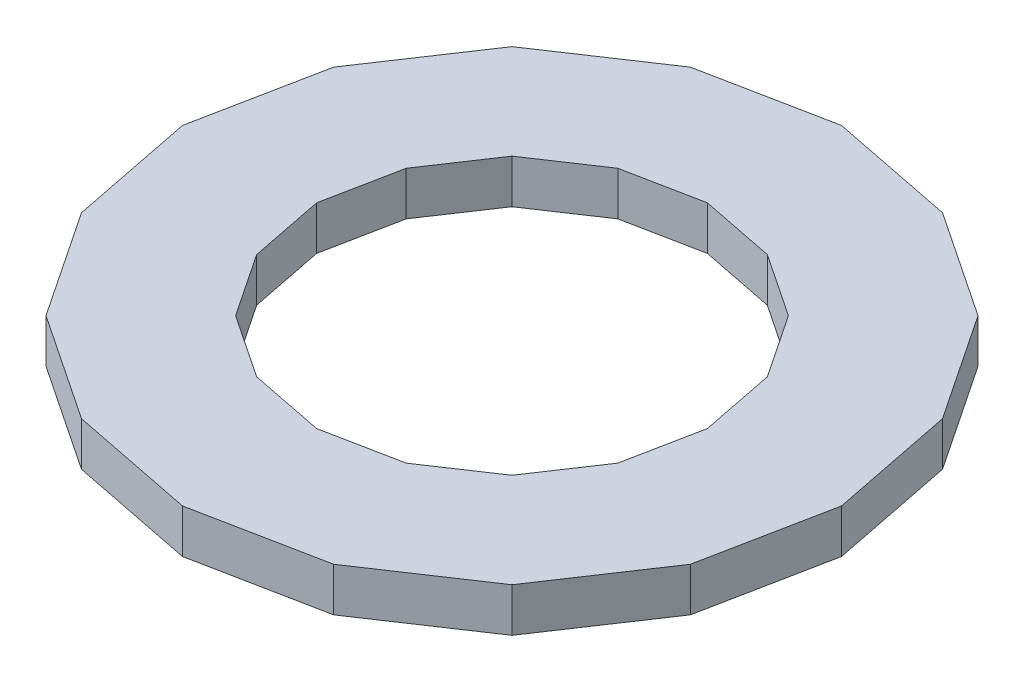
ISO-10303-21;
HEADER;
FILE_DESCRIPTION(('STEP AP214'),'2;1');
FILE_NAME('part.step','',(''),(''),'','','');
FILE_SCHEMA(('AUTOMOTIVE_DESIGN { 1 0 10303 214 1 1 1 1 }'));
ENDSEC;
DATA;
#1=APPLICATION_CONTEXT('core data for automotive mechanical design processes');
#2=APPLICATION_PROTOCOL_DEFINITION('international standard','automotive_design',2000,#1);
#3=PRODUCT_CONTEXT('',#1,'mechanical');
#4=PRODUCT('Part','Part','',(#3));
#5=PRODUCT_RELATED_PRODUCT_CATEGORY('part','',(#4));
#6=PRODUCT_DEFINITION_FORMATION('','',#4);
#7=PRODUCT_DEFINITION_CONTEXT('part definition',#1,'design');
#8=PRODUCT_DEFINITION('design','',#6,#7);
#9=PRODUCT_DEFINITION_SHAPE('','',#8);
#10=(LENGTH_UNIT() NAMED_UNIT(*) SI_UNIT(.MILLI.,.METRE.));
#11=(NAMED_UNIT(*) PLANE_ANGLE_UNIT() SI_UNIT($,.RADIAN.));
#12=(NAMED_UNIT(*) SI_UNIT($,.STERADIAN.) SOLID_ANGLE_UNIT());
#13=UNCERTAINTY_MEASURE_WITH_UNIT(LENGTH_MEASURE(1.E-05),#10,'distance_accuracy_value','');
#14=(GEOMETRIC_REPRESENTATION_CONTEXT(3) GLOBAL_UNCERTAINTY_ASSIGNED_CONTEXT((#13)) GLOBAL_UNIT_ASSIGNED_CONTEXT((#10,
#11,#12)) REPRESENTATION_CONTEXT('',''));
#15=CARTESIAN_POINT('',(0.,0.,0.));
#16=DIRECTION('',(0.,0.,1.));
#17=DIRECTION('',(1.,0.,0.));
#18=AXIS2_PLACEMENT_3D('',#15,#16,#17);
#19=CARTESIAN_POINT('',(0.,19.05,0.));
#20=DIRECTION('',(0.,1.,0.));
#21=DIRECTION('',(0.,0.,1.));
#22=AXIS2_PLACEMENT_3D('',#19,#20,#21);
#23=PLANE('',#22);
#24=DIRECTION('',(0.195090322016117,0.,-0.980785280403233));
#25=VECTOR('',#24,1.);
#26=CARTESIAN_POINT('',(132.314068025535,19.05,54.806281468931));
#27=LINE('',#26,#25);
#28=CARTESIAN_POINT('',(132.314068025535,19.05,54.806281468931));
#29=VERTEX_POINT('',#28);
#30=CARTESIAN_POINT('',(143.215715219795,19.05,-1.59247133447802E-12));
#31=VERTEX_POINT('',#30);
#32=EDGE_CURVE('E372',#29,#31,#27,.T.);
#33=ORIENTED_EDGE('',*,*,#32,.T.);
#34=DIRECTION('',(-0.195090322016139,0.,-0.980785280403228));
#35=VECTOR('',#34,1.);
#36=CARTESIAN_POINT('',(143.215715219795,19.05,-1.59247133447802E-12));
#37=LINE('',#36,#35);
#38=CARTESIAN_POINT('',(132.314068025533,19.05,-54.806281468934));
#39=VERTEX_POINT('',#38);
#40=EDGE_CURVE('E375',#31,#39,#37,.T.);
#41=ORIENTED_EDGE('',*,*,#40,.T.);
#42=DIRECTION('',(-0.555570233019612,0.,-0.831469612302539));
#43=VECTOR('',#42,1.);
#44=CARTESIAN_POINT('',(132.314068025533,19.05,-54.806281468934));
#45=LINE('',#44,#43);
#46=CARTESIAN_POINT('',(101.268803404398,19.05,-101.2688034044));
#47=VERTEX_POINT('',#46);
#48=EDGE_CURVE('E379',#39,#47,#45,.T.);
#49=ORIENTED_EDGE('',*,*,#48,.T.);
#50=DIRECTION('',(-0.831469612302551,0.,-0.555570233019593));
#51=VECTOR('',#50,1.);
#52=CARTESIAN_POINT('',(101.268803404398,19.05,-101.2688034044));
#53=LINE('',#52,#51);
#54=CARTESIAN_POINT('',(54.8062814689311,19.05,-132.314068025535));
#55=VERTEX_POINT('',#54);
#56=EDGE_CURVE('E382',#47,#55,#53,.T.);
#57=ORIENTED_EDGE('',*,*,#56,.T.);
#58=DIRECTION('',(-0.980785280403233,0.,-0.195090322016117));
#59=VECTOR('',#58,1.);
#60=CARTESIAN_POINT('',(54.8062814689311,19.05,-132.314068025535));
#61=LINE('',#60,#59);
#62=CARTESIAN_POINT('',(-1.68610724699765E-12,19.05,-143.215715219795));
#63=VERTEX_POINT('',#62);
#64=EDGE_CURVE('E384',#55,#63,#61,.T.);
#65=ORIENTED_EDGE('',*,*,#64,.T.);
#66=DIRECTION('',(-0.980785280403228,0.,0.195090322016139));
#67=VECTOR('',#66,1.);
#68=CARTESIAN_POINT('',(-1.68610724699765E-12,19.05,-143.215715219795));
#69=LINE('',#68,#67);
#70=CARTESIAN_POINT('',(-54.806281468934,19.05,-132.314068025533));
#71=VERTEX_POINT('',#70);
#72=EDGE_CURVE('E386',#63,#71,#69,.T.);
#73=ORIENTED_EDGE('',*,*,#72,.T.);
#74=DIRECTION('',(-0.831469612302539,0.,0.555570233019611));
#75=VECTOR('',#74,1.);
#76=CARTESIAN_POINT('',(-54.806281468934,19.05,-132.314068025533));
#77=LINE('',#76,#75);
#78=CARTESIAN_POINT('',(-101.2688034044,19.05,-101.268803404398));
#79=VERTEX_POINT('',#78);
#80=EDGE_CURVE('E388',#71,#79,#77,.T.);
#81=ORIENTED_EDGE('',*,*,#80,.T.);
#82=DIRECTION('',(-0.555570233019593,0.,0.831469612302551));
#83=VECTOR('',#82,1.);
#84=CARTESIAN_POINT('',(-101.2688034044,19.05,-101.268803404398));
#85=LINE('',#84,#83);
#86=CARTESIAN_POINT('',(-132.314068025535,19.05,-54.806281468931));
#87=VERTEX_POINT('',#86);
#88=EDGE_CURVE('E390',#79,#87,#85,.T.);
#89=ORIENTED_EDGE('',*,*,#88,.T.);
#90=DIRECTION('',(-0.195090322016117,0.,0.980785280403233));
#91=VECTOR('',#90,1.);
#92=CARTESIAN_POINT('',(-132.314068025535,19.05,-54.806281468931));
#93=LINE('',#92,#91);
#94=CARTESIAN_POINT('',(-143.215715219795,19.05,1.53307639008423E-12));
#95=VERTEX_POINT('',#94);
#96=EDGE_CURVE('E392',#87,#95,#93,.T.);
#97=ORIENTED_EDGE('',*,*,#96,.T.);
#98=DIRECTION('',(0.195090322016139,0.,0.980785280403228));
#99=VECTOR('',#98,1.);
#100=CARTESIAN_POINT('',(-143.215715219795,19.05,1.53307639008423E-12));
#101=LINE('',#100,#99);
#102=CARTESIAN_POINT('',(-132.314068025533,19.05,54.806281468934));
#103=VERTEX_POINT('',#102);
#104=EDGE_CURVE('E394',#95,#103,#101,.T.);
#105=ORIENTED_EDGE('',*,*,#104,.T.);
#106=DIRECTION('',(0.555570233019611,0.,0.831469612302539));
#107=VECTOR('',#106,1.);
#108=CARTESIAN_POINT('',(-132.314068025533,19.05,54.806281468934));
#109=LINE('',#108,#107);
#110=CARTESIAN_POINT('',(-101.268803404398,19.05,101.2688034044));
#111=VERTEX_POINT('',#110);
#112=EDGE_CURVE('E396',#103,#111,#109,.T.);
#113=ORIENTED_EDGE('',*,*,#112,.T.);
#114=DIRECTION('',(0.831469612302551,0.,0.555570233019593));
#115=VECTOR('',#114,1.);
#116=CARTESIAN_POINT('',(-101.268803404398,19.05,101.2688034044));
#117=LINE('',#116,#115);
#118=CARTESIAN_POINT('',(-54.8062814689311,19.05,132.314068025535));
#119=VERTEX_POINT('',#118);
#120=EDGE_CURVE('E398',#111,#119,#117,.T.);
#121=ORIENTED_EDGE('',*,*,#120,.T.);
#122=DIRECTION('',(0.980785280403233,0.,0.195090322016118));
#123=VECTOR('',#122,1.);
#124=CARTESIAN_POINT('',(-54.8062814689311,19.05,132.314068025535));
#125=LINE('',#124,#123);
#126=CARTESIAN_POINT('',(1.55718594322189E-12,19.05,143.215715219795));
#127=VERTEX_POINT('',#126);
#128=EDGE_CURVE('E400',#119,#127,#125,.T.);
#129=ORIENTED_EDGE('',*,*,#128,.T.);
#130=DIRECTION('',(0.980785280403228,0.,-0.195090322016139));
#131=VECTOR('',#130,1.);
#132=CARTESIAN_POINT('',(1.55718594322189E-12,19.05,143.215715219795));
#133=LINE('',#132,#131);
#134=CARTESIAN_POINT('',(54.8062814689339,19.05,132.314068025534));
#135=VERTEX_POINT('',#134);
#136=EDGE_CURVE('E402',#127,#135,#133,.T.);
#137=ORIENTED_EDGE('',*,*,#136,.T.);
#138=DIRECTION('',(0.831469612302539,0.,-0.555570233019612));
#139=VECTOR('',#138,1.);
#140=CARTESIAN_POINT('',(54.8062814689339,19.05,132.314068025534));
#141=LINE('',#140,#139);
#142=CARTESIAN_POINT('',(101.2688034044,19.05,101.268803404398));
#143=VERTEX_POINT('',#142);
#144=EDGE_CURVE('E404',#135,#143,#141,.T.);
#145=ORIENTED_EDGE('',*,*,#144,.T.);
#146=DIRECTION('',(0.555570233019593,0.,-0.831469612302551));
#147=VECTOR('',#146,1.);
#148=CARTESIAN_POINT('',(101.2688034044,19.05,101.268803404398));
#149=LINE('',#148,#147);
#150=EDGE_CURVE('E407',#143,#29,#149,.T.);
#151=ORIENTED_EDGE('',*,*,#150,.T.);
#152=EDGE_LOOP('',(#33,#41,#49,#57,#65,#73,#81,#89,#97,#105,#113,#121,#129,#137,#145,#151));
#153=FACE_BOUND('',#152,.T.);
#154=DIRECTION('',(-0.195090322016139,0.,-0.980785280403228));
#155=VECTOR('',#154,1.);
#156=CARTESIAN_POINT('',(84.9460805281899,19.05,-9.53928678404052E-13));
#157=LINE('',#156,#155);
#158=CARTESIAN_POINT('',(84.9460805281899,19.05,-9.53928678404052E-13));
#159=VERTEX_POINT('',#158);
#160=CARTESIAN_POINT('',(78.4799451670499,19.05,-32.5074576624899));
#161=VERTEX_POINT('',#160);
#162=EDGE_CURVE('E251',#159,#161,#157,.T.);
#163=ORIENTED_EDGE('',*,*,#162,.F.);
#164=DIRECTION('',(0.195090322016117,0.,-0.980785280403233));
#165=VECTOR('',#164,1.);
#166=CARTESIAN_POINT('',(78.4799451670506,19.05,32.5074576624882));
#167=LINE('',#166,#165);
#168=CARTESIAN_POINT('',(78.4799451670506,19.05,32.5074576624882));
#169=VERTEX_POINT('',#168);
#170=EDGE_CURVE('E243',#169,#159,#167,.T.);
#171=ORIENTED_EDGE('',*,*,#170,.F.);
#172=DIRECTION('',(0.555570233019593,0.,-0.831469612302552));
#173=VECTOR('',#172,1.);
#174=CARTESIAN_POINT('',(60.0659495767023,19.05,60.065949576701));
#175=LINE('',#174,#173);
#176=CARTESIAN_POINT('',(60.0659495767023,19.05,60.065949576701));
#177=VERTEX_POINT('',#176);
#178=EDGE_CURVE('E297',#177,#169,#175,.T.);
#179=ORIENTED_EDGE('',*,*,#178,.F.);
#180=DIRECTION('',(0.831469612302539,0.,-0.555570233019611));
#181=VECTOR('',#180,1.);
#182=CARTESIAN_POINT('',(32.50745766249,19.05,78.4799451670499));
#183=LINE('',#182,#181);
#184=CARTESIAN_POINT('',(32.50745766249,19.05,78.4799451670499));
#185=VERTEX_POINT('',#184);
#186=EDGE_CURVE('E294',#185,#177,#183,.T.);
#187=ORIENTED_EDGE('',*,*,#186,.F.);
#188=DIRECTION('',(0.980785280403228,0.,-0.19509032201614));
#189=VECTOR('',#188,1.);
#190=CARTESIAN_POINT('',(9.82701200833361E-13,19.05,84.94608052819));
#191=LINE('',#190,#189);
#192=CARTESIAN_POINT('',(9.82701200833361E-13,19.05,84.94608052819));
#193=VERTEX_POINT('',#192);
#194=EDGE_CURVE('E292',#193,#185,#191,.T.);
#195=ORIENTED_EDGE('',*,*,#194,.F.);
#196=DIRECTION('',(0.980785280403233,0.,0.195090322016117));
#197=VECTOR('',#196,1.);
#198=CARTESIAN_POINT('',(-32.5074576624881,19.05,78.4799451670506));
#199=LINE('',#198,#197);
#200=CARTESIAN_POINT('',(-32.5074576624881,19.05,78.4799451670506));
#201=VERTEX_POINT('',#200);
#202=EDGE_CURVE('E290',#201,#193,#199,.T.);
#203=ORIENTED_EDGE('',*,*,#202,.F.);
#204=DIRECTION('',(0.831469612302551,0.,0.555570233019593));
#205=VECTOR('',#204,1.);
#206=CARTESIAN_POINT('',(-60.0659495767009,19.05,60.0659495767023));
#207=LINE('',#206,#205);
#208=CARTESIAN_POINT('',(-60.0659495767009,19.05,60.0659495767023));
#209=VERTEX_POINT('',#208);
#210=EDGE_CURVE('E288',#209,#201,#207,.T.);
#211=ORIENTED_EDGE('',*,*,#210,.F.);
#212=DIRECTION('',(0.555570233019612,0.,0.831469612302539));
#213=VECTOR('',#212,1.);
#214=CARTESIAN_POINT('',(-78.4799451670498,19.05,32.5074576624899));
#215=LINE('',#214,#213);
#216=CARTESIAN_POINT('',(-78.4799451670498,19.05,32.5074576624899));
#217=VERTEX_POINT('',#216);
#218=EDGE_CURVE('E286',#217,#209,#215,.T.);
#219=ORIENTED_EDGE('',*,*,#218,.F.);
#220=DIRECTION('',(0.195090322016139,0.,0.980785280403228));
#221=VECTOR('',#220,1.);
#222=CARTESIAN_POINT('',(-84.9460805281899,19.05,9.51419658589963E-13));
#223=LINE('',#222,#221);
#224=CARTESIAN_POINT('',(-84.9460805281899,19.05,9.51419658589963E-13));
#225=VERTEX_POINT('',#224);
#226=EDGE_CURVE('E284',#225,#217,#223,.T.);
#227=ORIENTED_EDGE('',*,*,#226,.F.);
#228=DIRECTION('',(-0.195090322016117,0.,0.980785280403233));
#229=VECTOR('',#228,1.);
#230=CARTESIAN_POINT('',(-78.4799451670506,19.05,-32.5074576624881));
#231=LINE('',#230,#229);
#232=CARTESIAN_POINT('',(-78.4799451670506,19.05,-32.5074576624881));
#233=VERTEX_POINT('',#232);
#234=EDGE_CURVE('E282',#233,#225,#231,.T.);
#235=ORIENTED_EDGE('',*,*,#234,.F.);
#236=DIRECTION('',(-0.555570233019593,0.,0.831469612302551));
#237=VECTOR('',#236,1.);
#238=CARTESIAN_POINT('',(-60.0659495767023,19.05,-60.0659495767009));
#239=LINE('',#238,#237);
#240=CARTESIAN_POINT('',(-60.0659495767023,19.05,-60.0659495767009));
#241=VERTEX_POINT('',#240);
#242=EDGE_CURVE('E280',#241,#233,#239,.T.);
#243=ORIENTED_EDGE('',*,*,#242,.F.);
#244=DIRECTION('',(-0.831469612302539,0.,0.555570233019612));
#245=VECTOR('',#244,1.);
#246=CARTESIAN_POINT('',(-32.5074576624899,19.05,-78.4799451670499));
#247=LINE('',#246,#245);
#248=CARTESIAN_POINT('',(-32.5074576624899,19.05,-78.4799451670499));
#249=VERTEX_POINT('',#248);
#250=EDGE_CURVE('E278',#249,#241,#247,.T.);
#251=ORIENTED_EDGE('',*,*,#250,.F.);
#252=DIRECTION('',(-0.980785280403228,0.,0.195090322016139));
#253=VECTOR('',#252,1.);
#254=CARTESIAN_POINT('',(-9.74271516221104E-13,19.05,-84.9460805281899));
#255=LINE('',#254,#253);
#256=CARTESIAN_POINT('',(-9.74271516221104E-13,19.05,-84.9460805281899));
#257=VERTEX_POINT('',#256);
#258=EDGE_CURVE('E276',#257,#249,#255,.T.);
#259=ORIENTED_EDGE('',*,*,#258,.F.);
#260=DIRECTION('',(-0.980785280403233,0.,-0.195090322016117));
#261=VECTOR('',#260,1.);
#262=CARTESIAN_POINT('',(32.5074576624882,19.05,-78.4799451670506));
#263=LINE('',#262,#261);
#264=CARTESIAN_POINT('',(32.5074576624882,19.05,-78.4799451670506));
#265=VERTEX_POINT('',#264);
#266=EDGE_CURVE('E274',#265,#257,#263,.T.);
#267=ORIENTED_EDGE('',*,*,#266,.F.);
#268=DIRECTION('',(-0.831469612302552,0.,-0.555570233019593));
#269=VECTOR('',#268,1.);
#270=CARTESIAN_POINT('',(60.065949576701,19.05,-60.0659495767023));
#271=LINE('',#270,#269);
#272=CARTESIAN_POINT('',(60.065949576701,19.05,-60.0659495767023));
#273=VERTEX_POINT('',#272);
#274=EDGE_CURVE('E270',#273,#265,#271,.T.);
#275=ORIENTED_EDGE('',*,*,#274,.F.);
#276=DIRECTION('',(-0.555570233019612,0.,-0.831469612302539));
#277=VECTOR('',#276,1.);
#278=CARTESIAN_POINT('',(78.4799451670499,19.05,-32.5074576624899));
#279=LINE('',#278,#277);
#280=EDGE_CURVE('E264',#161,#273,#279,.T.);
#281=ORIENTED_EDGE('',*,*,#280,.F.);
#282=EDGE_LOOP('',(#163,#171,#179,#187,#195,#203,#211,#219,#227,#235,#243,#251,#259,#267,#275,#281));
#283=FACE_BOUND('',#282,.T.);
#284=ADVANCED_FACE('F34',(#153,#283),#23,.T.);
#285=CARTESIAN_POINT('',(0.,0.,0.));
#286=DIRECTION('',(0.,1.,0.));
#287=DIRECTION('',(0.,0.,1.));
#288=AXIS2_PLACEMENT_3D('',#285,#286,#287);
#289=PLANE('',#288);
#290=DIRECTION('',(0.195090322016117,0.,-0.980785280403233));
#291=VECTOR('',#290,1.);
#292=CARTESIAN_POINT('',(132.314068025535,0.,54.806281468931));
#293=LINE('',#292,#291);
#294=CARTESIAN_POINT('',(132.314068025535,0.,54.806281468931));
#295=VERTEX_POINT('',#294);
#296=CARTESIAN_POINT('',(143.215715219795,0.,-1.59247133447802E-12));
#297=VERTEX_POINT('',#296);
#298=EDGE_CURVE('E259',#295,#297,#293,.T.);
#299=ORIENTED_EDGE('',*,*,#298,.F.);
#300=DIRECTION('',(0.555570233019593,0.,-0.831469612302551));
#301=VECTOR('',#300,1.);
#302=CARTESIAN_POINT('',(101.2688034044,0.,101.268803404398));
#303=LINE('',#302,#301);
#304=CARTESIAN_POINT('',(101.2688034044,0.,101.268803404398));
#305=VERTEX_POINT('',#304);
#306=EDGE_CURVE('E376',#305,#295,#303,.T.);
#307=ORIENTED_EDGE('',*,*,#306,.F.);
#308=DIRECTION('',(0.831469612302539,0.,-0.555570233019612));
#309=VECTOR('',#308,1.);
#310=CARTESIAN_POINT('',(54.8062814689339,0.,132.314068025534));
#311=LINE('',#310,#309);
#312=CARTESIAN_POINT('',(54.8062814689339,0.,132.314068025534));
#313=VERTEX_POINT('',#312);
#314=EDGE_CURVE('E439',#313,#305,#311,.T.);
#315=ORIENTED_EDGE('',*,*,#314,.F.);
#316=DIRECTION('',(0.980785280403228,0.,-0.195090322016139));
#317=VECTOR('',#316,1.);
#318=CARTESIAN_POINT('',(1.55718594322189E-12,0.,143.215715219795));
#319=LINE('',#318,#317);
#320=CARTESIAN_POINT('',(1.55718594322189E-12,0.,143.215715219795));
#321=VERTEX_POINT('',#320);
#322=EDGE_CURVE('E437',#321,#313,#319,.T.);
#323=ORIENTED_EDGE('',*,*,#322,.F.);
#324=DIRECTION('',(0.980785280403233,0.,0.195090322016118));
#325=VECTOR('',#324,1.);
#326=CARTESIAN_POINT('',(-54.8062814689311,0.,132.314068025535));
#327=LINE('',#326,#325);
#328=CARTESIAN_POINT('',(-54.8062814689311,0.,132.314068025535));
#329=VERTEX_POINT('',#328);
#330=EDGE_CURVE('E435',#329,#321,#327,.T.);
#331=ORIENTED_EDGE('',*,*,#330,.F.);
#332=DIRECTION('',(0.831469612302551,0.,0.555570233019593));
#333=VECTOR('',#332,1.);
#334=CARTESIAN_POINT('',(-101.268803404398,0.,101.2688034044));
#335=LINE('',#334,#333);
#336=CARTESIAN_POINT('',(-101.268803404398,0.,101.2688034044));
#337=VERTEX_POINT('',#336);
#338=EDGE_CURVE('E433',#337,#329,#335,.T.);
#339=ORIENTED_EDGE('',*,*,#338,.F.);
#340=DIRECTION('',(0.555570233019611,0.,0.831469612302539));
#341=VECTOR('',#340,1.);
#342=CARTESIAN_POINT('',(-132.314068025533,0.,54.806281468934));
#343=LINE('',#342,#341);
#344=CARTESIAN_POINT('',(-132.314068025533,0.,54.806281468934));
#345=VERTEX_POINT('',#344);
#346=EDGE_CURVE('E431',#345,#337,#343,.T.);
#347=ORIENTED_EDGE('',*,*,#346,.F.);
#348=DIRECTION('',(0.195090322016139,0.,0.980785280403228));
#349=VECTOR('',#348,1.);
#350=CARTESIAN_POINT('',(-143.215715219795,0.,1.53307639008423E-12));
#351=LINE('',#350,#349);
#352=CARTESIAN_POINT('',(-143.215715219795,0.,1.53307639008423E-12));
#353=VERTEX_POINT('',#352);
#354=EDGE_CURVE('E429',#353,#345,#351,.T.);
#355=ORIENTED_EDGE('',*,*,#354,.F.);
#356=DIRECTION('',(-0.195090322016117,0.,0.980785280403233));
#357=VECTOR('',#356,1.);
#358=CARTESIAN_POINT('',(-132.314068025535,0.,-54.806281468931));
#359=LINE('',#358,#357);
#360=CARTESIAN_POINT('',(-132.314068025535,0.,-54.806281468931));
#361=VERTEX_POINT('',#360);
#362=EDGE_CURVE('E427',#361,#353,#359,.T.);
#363=ORIENTED_EDGE('',*,*,#362,.F.);
#364=DIRECTION('',(-0.555570233019593,0.,0.831469612302551));
#365=VECTOR('',#364,1.);
#366=CARTESIAN_POINT('',(-101.2688034044,0.,-101.268803404398));
#367=LINE('',#366,#365);
#368=CARTESIAN_POINT('',(-101.2688034044,0.,-101.268803404398));
#369=VERTEX_POINT('',#368);
#370=EDGE_CURVE('E425',#369,#361,#367,.T.);
#371=ORIENTED_EDGE('',*,*,#370,.F.);
#372=DIRECTION('',(-0.831469612302539,0.,0.555570233019611));
#373=VECTOR('',#372,1.);
#374=CARTESIAN_POINT('',(-54.806281468934,0.,-132.314068025533));
#375=LINE('',#374,#373);
#376=CARTESIAN_POINT('',(-54.806281468934,0.,-132.314068025533));
#377=VERTEX_POINT('',#376);
#378=EDGE_CURVE('E423',#377,#369,#375,.T.);
#379=ORIENTED_EDGE('',*,*,#378,.F.);
#380=DIRECTION('',(-0.980785280403228,0.,0.195090322016139));
#381=VECTOR('',#380,1.);
#382=CARTESIAN_POINT('',(-1.68610724699765E-12,0.,-143.215715219795));
#383=LINE('',#382,#381);
#384=CARTESIAN_POINT('',(-1.68610724699765E-12,0.,-143.215715219795));
#385=VERTEX_POINT('',#384);
#386=EDGE_CURVE('E421',#385,#377,#383,.T.);
#387=ORIENTED_EDGE('',*,*,#386,.F.);
#388=DIRECTION('',(-0.980785280403233,0.,-0.195090322016117));
#389=VECTOR('',#388,1.);
#390=CARTESIAN_POINT('',(54.8062814689311,0.,-132.314068025535));
#391=LINE('',#390,#389);
#392=CARTESIAN_POINT('',(54.8062814689311,0.,-132.314068025535));
#393=VERTEX_POINT('',#392);
#394=EDGE_CURVE('E419',#393,#385,#391,.T.);
#395=ORIENTED_EDGE('',*,*,#394,.F.);
#396=DIRECTION('',(-0.831469612302551,0.,-0.555570233019593));
#397=VECTOR('',#396,1.);
#398=CARTESIAN_POINT('',(101.268803404398,0.,-101.2688034044));
#399=LINE('',#398,#397);
#400=CARTESIAN_POINT('',(101.268803404398,0.,-101.2688034044));
#401=VERTEX_POINT('',#400);
#402=EDGE_CURVE('E417',#401,#393,#399,.T.);
#403=ORIENTED_EDGE('',*,*,#402,.F.);
#404=DIRECTION('',(-0.555570233019612,0.,-0.831469612302539));
#405=VECTOR('',#404,1.);
#406=CARTESIAN_POINT('',(132.314068025533,0.,-54.806281468934));
#407=LINE('',#406,#405);
#408=CARTESIAN_POINT('',(132.314068025533,0.,-54.806281468934));
#409=VERTEX_POINT('',#408);
#410=EDGE_CURVE('E414',#409,#401,#407,.T.);
#411=ORIENTED_EDGE('',*,*,#410,.F.);
#412=DIRECTION('',(-0.195090322016139,0.,-0.980785280403228));
#413=VECTOR('',#412,1.);
#414=CARTESIAN_POINT('',(143.215715219795,0.,-1.59247133447802E-12));
#415=LINE('',#414,#413);
#416=EDGE_CURVE('E412',#297,#409,#415,.T.);
#417=ORIENTED_EDGE('',*,*,#416,.F.);
#418=EDGE_LOOP('',(#299,#307,#315,#323,#331,#339,#347,#355,#363,#371,#379,#387,#395,#403,#411,#417));
#419=FACE_BOUND('',#418,.T.);
#420=DIRECTION('',(0.195090322016117,0.,-0.980785280403233));
#421=VECTOR('',#420,1.);
#422=CARTESIAN_POINT('',(78.4799451670506,0.,32.5074576624882));
#423=LINE('',#422,#421);
#424=CARTESIAN_POINT('',(78.4799451670506,0.,32.5074576624882));
#425=VERTEX_POINT('',#424);
#426=CARTESIAN_POINT('',(84.9460805281899,0.,-9.53928678404052E-13));
#427=VERTEX_POINT('',#426);
#428=EDGE_CURVE('E57',#425,#427,#423,.T.);
#429=ORIENTED_EDGE('',*,*,#428,.T.);
#430=DIRECTION('',(-0.195090322016139,0.,-0.980785280403228));
#431=VECTOR('',#430,1.);
#432=CARTESIAN_POINT('',(84.9460805281899,0.,-9.53928678404052E-13));
#433=LINE('',#432,#431);
#434=CARTESIAN_POINT('',(78.4799451670499,0.,-32.5074576624899));
#435=VERTEX_POINT('',#434);
#436=EDGE_CURVE('E258',#427,#435,#433,.T.);
#437=ORIENTED_EDGE('',*,*,#436,.T.);
#438=DIRECTION('',(-0.555570233019612,0.,-0.831469612302539));
#439=VECTOR('',#438,1.);
#440=CARTESIAN_POINT('',(78.4799451670499,0.,-32.5074576624899));
#441=LINE('',#440,#439);
#442=CARTESIAN_POINT('',(60.065949576701,0.,-60.0659495767023));
#443=VERTEX_POINT('',#442);
#444=EDGE_CURVE('E301',#435,#443,#441,.T.);
#445=ORIENTED_EDGE('',*,*,#444,.T.);
#446=DIRECTION('',(-0.831469612302552,0.,-0.555570233019593));
#447=VECTOR('',#446,1.);
#448=CARTESIAN_POINT('',(60.065949576701,0.,-60.0659495767023));
#449=LINE('',#448,#447);
#450=CARTESIAN_POINT('',(32.5074576624882,0.,-78.4799451670506));
#451=VERTEX_POINT('',#450);
#452=EDGE_CURVE('E304',#443,#451,#449,.T.);
#453=ORIENTED_EDGE('',*,*,#452,.T.);
#454=DIRECTION('',(-0.980785280403233,0.,-0.195090322016117));
#455=VECTOR('',#454,1.);
#456=CARTESIAN_POINT('',(32.5074576624882,0.,-78.4799451670506));
#457=LINE('',#456,#455);
#458=CARTESIAN_POINT('',(-9.74271516221104E-13,0.,-84.9460805281899));
#459=VERTEX_POINT('',#458);
#460=EDGE_CURVE('E307',#451,#459,#457,.T.);
#461=ORIENTED_EDGE('',*,*,#460,.T.);
#462=DIRECTION('',(-0.980785280403228,0.,0.195090322016139));
#463=VECTOR('',#462,1.);
#464=CARTESIAN_POINT('',(-9.74271516221104E-13,0.,-84.9460805281899));
#465=LINE('',#464,#463);
#466=CARTESIAN_POINT('',(-32.5074576624899,0.,-78.4799451670499));
#467=VERTEX_POINT('',#466);
#468=EDGE_CURVE('E310',#459,#467,#465,.T.);
#469=ORIENTED_EDGE('',*,*,#468,.T.);
#470=DIRECTION('',(-0.831469612302539,0.,0.555570233019612));
#471=VECTOR('',#470,1.);
#472=CARTESIAN_POINT('',(-32.5074576624899,0.,-78.4799451670499));
#473=LINE('',#472,#471);
#474=CARTESIAN_POINT('',(-60.0659495767023,0.,-60.0659495767009));
#475=VERTEX_POINT('',#474);
#476=EDGE_CURVE('E313',#467,#475,#473,.T.);
#477=ORIENTED_EDGE('',*,*,#476,.T.);
#478=DIRECTION('',(-0.555570233019593,0.,0.831469612302551));
#479=VECTOR('',#478,1.);
#480=CARTESIAN_POINT('',(-60.0659495767023,0.,-60.0659495767009));
#481=LINE('',#480,#479);
#482=CARTESIAN_POINT('',(-78.4799451670506,0.,-32.5074576624881));
#483=VERTEX_POINT('',#482);
#484=EDGE_CURVE('E316',#475,#483,#481,.T.);
#485=ORIENTED_EDGE('',*,*,#484,.T.);
#486=DIRECTION('',(-0.195090322016117,0.,0.980785280403233));
#487=VECTOR('',#486,1.);
#488=CARTESIAN_POINT('',(-78.4799451670506,0.,-32.5074576624881));
#489=LINE('',#488,#487);
#490=CARTESIAN_POINT('',(-84.9460805281899,0.,9.51419658589963E-13));
#491=VERTEX_POINT('',#490);
#492=EDGE_CURVE('E319',#483,#491,#489,.T.);
#493=ORIENTED_EDGE('',*,*,#492,.T.);
#494=DIRECTION('',(0.195090322016139,0.,0.980785280403228));
#495=VECTOR('',#494,1.);
#496=CARTESIAN_POINT('',(-84.9460805281899,0.,9.51419658589963E-13));
#497=LINE('',#496,#495);
#498=CARTESIAN_POINT('',(-78.4799451670498,0.,32.5074576624899));
#499=VERTEX_POINT('',#498);
#500=EDGE_CURVE('E322',#491,#499,#497,.T.);
#501=ORIENTED_EDGE('',*,*,#500,.T.);
#502=DIRECTION('',(0.555570233019612,0.,0.831469612302539));
#503=VECTOR('',#502,1.);
#504=CARTESIAN_POINT('',(-78.4799451670498,0.,32.5074576624899));
#505=LINE('',#504,#503);
#506=CARTESIAN_POINT('',(-60.0659495767009,0.,60.0659495767023));
#507=VERTEX_POINT('',#506);
#508=EDGE_CURVE('E325',#499,#507,#505,.T.);
#509=ORIENTED_EDGE('',*,*,#508,.T.);
#510=DIRECTION('',(0.831469612302551,0.,0.555570233019593));
#511=VECTOR('',#510,1.);
#512=CARTESIAN_POINT('',(-60.0659495767009,0.,60.0659495767023));
#513=LINE('',#512,#511);
#514=CARTESIAN_POINT('',(-32.5074576624881,0.,78.4799451670506));
#515=VERTEX_POINT('',#514);
#516=EDGE_CURVE('E329',#507,#515,#513,.T.);
#517=ORIENTED_EDGE('',*,*,#516,.T.);
#518=DIRECTION('',(0.980785280403233,0.,0.195090322016117));
#519=VECTOR('',#518,1.);
#520=CARTESIAN_POINT('',(-32.5074576624881,0.,78.4799451670506));
#521=LINE('',#520,#519);
#522=CARTESIAN_POINT('',(9.82701200833361E-13,0.,84.94608052819));
#523=VERTEX_POINT('',#522);
#524=EDGE_CURVE('E332',#515,#523,#521,.T.);
#525=ORIENTED_EDGE('',*,*,#524,.T.);
#526=DIRECTION('',(0.980785280403228,0.,-0.19509032201614));
#527=VECTOR('',#526,1.);
#528=CARTESIAN_POINT('',(9.82701200833361E-13,0.,84.94608052819));
#529=LINE('',#528,#527);
#530=CARTESIAN_POINT('',(32.50745766249,0.,78.4799451670499));
#531=VERTEX_POINT('',#530);
#532=EDGE_CURVE('E335',#523,#531,#529,.T.);
#533=ORIENTED_EDGE('',*,*,#532,.T.);
#534=DIRECTION('',(0.831469612302539,0.,-0.555570233019611));
#535=VECTOR('',#534,1.);
#536=CARTESIAN_POINT('',(32.50745766249,0.,78.4799451670499));
#537=LINE('',#536,#535);
#538=CARTESIAN_POINT('',(60.0659495767023,0.,60.065949576701));
#539=VERTEX_POINT('',#538);
#540=EDGE_CURVE('E338',#531,#539,#537,.T.);
#541=ORIENTED_EDGE('',*,*,#540,.T.);
#542=DIRECTION('',(0.555570233019593,0.,-0.831469612302552));
#543=VECTOR('',#542,1.);
#544=CARTESIAN_POINT('',(60.0659495767023,0.,60.065949576701));
#545=LINE('',#544,#543);
#546=EDGE_CURVE('E252',#539,#425,#545,.T.);
#547=ORIENTED_EDGE('',*,*,#546,.T.);
#548=EDGE_LOOP('',(#429,#437,#445,#453,#461,#469,#477,#485,#493,#501,#509,#517,#525,#533,#541,#547));
#549=FACE_BOUND('',#548,.T.);
#550=ADVANCED_FACE('F497',(#419,#549),#289,.F.);
#551=CARTESIAN_POINT('',(132.314068025535,19.05,54.806281468931));
#552=DIRECTION('',(-0.980785280403233,0.,-0.195090322016117));
#553=DIRECTION('',(-0.195090322016117,0.,0.980785280403233));
#554=AXIS2_PLACEMENT_3D('',#551,#552,#553);
#555=PLANE('',#554);
#556=ORIENTED_EDGE('',*,*,#298,.T.);
#557=DIRECTION('',(0.,-1.,0.));
#558=VECTOR('',#557,1.);
#559=CARTESIAN_POINT('',(143.215715219795,19.05,-1.59247133447802E-12));
#560=LINE('',#559,#558);
#561=EDGE_CURVE('E11',#31,#297,#560,.T.);
#562=ORIENTED_EDGE('',*,*,#561,.F.);
#563=ORIENTED_EDGE('',*,*,#32,.F.);
#564=DIRECTION('',(0.,-1.,0.));
#565=VECTOR('',#564,1.);
#566=CARTESIAN_POINT('',(132.314068025535,19.05,54.806281468931));
#567=LINE('',#566,#565);
#568=EDGE_CURVE('E409',#29,#295,#567,.T.);
#569=ORIENTED_EDGE('',*,*,#568,.T.);
#570=EDGE_LOOP('',(#556,#562,#563,#569));
#571=FACE_BOUND('',#570,.T.);
#572=ADVANCED_FACE('F36',(#571),#555,.F.);
#573=CARTESIAN_POINT('',(143.215715219795,19.05,-1.59247133447802E-12));
#574=DIRECTION('',(-0.980785280403228,0.,0.195090322016139));
#575=DIRECTION('',(0.195090322016139,0.,0.980785280403228));
#576=AXIS2_PLACEMENT_3D('',#573,#574,#575);
#577=PLANE('',#576);
#578=ORIENTED_EDGE('',*,*,#416,.T.);
#579=DIRECTION('',(0.,-1.,0.));
#580=VECTOR('',#579,1.);
#581=CARTESIAN_POINT('',(132.314068025533,19.05,-54.806281468934));
#582=LINE('',#581,#580);
#583=EDGE_CURVE('E42',#39,#409,#582,.T.);
#584=ORIENTED_EDGE('',*,*,#583,.F.);
#585=ORIENTED_EDGE('',*,*,#40,.F.);
#586=ORIENTED_EDGE('',*,*,#561,.T.);
#587=EDGE_LOOP('',(#578,#584,#585,#586));
#588=FACE_BOUND('',#587,.T.);
#589=ADVANCED_FACE('F514',(#588),#577,.F.);
#590=CARTESIAN_POINT('',(132.314068025533,19.05,-54.806281468934));
#591=DIRECTION('',(-0.831469612302539,0.,0.555570233019612));
#592=DIRECTION('',(0.555570233019612,0.,0.831469612302539));
#593=AXIS2_PLACEMENT_3D('',#590,#591,#592);
#594=PLANE('',#593);
#595=ORIENTED_EDGE('',*,*,#410,.T.);
#596=DIRECTION('',(0.,-1.,0.));
#597=VECTOR('',#596,1.);
#598=CARTESIAN_POINT('',(101.268803404398,19.05,-101.2688034044));
#599=LINE('',#598,#597);
#600=EDGE_CURVE('E482',#47,#401,#599,.T.);
#601=ORIENTED_EDGE('',*,*,#600,.F.);
#602=ORIENTED_EDGE('',*,*,#48,.F.);
#603=ORIENTED_EDGE('',*,*,#583,.T.);
#604=EDGE_LOOP('',(#595,#601,#602,#603));
#605=FACE_BOUND('',#604,.T.);
#606=ADVANCED_FACE('F491',(#605),#594,.F.);
#607=CARTESIAN_POINT('',(101.268803404398,19.05,-101.2688034044));
#608=DIRECTION('',(-0.555570233019593,0.,0.831469612302551));
#609=DIRECTION('',(0.831469612302551,0.,0.555570233019593));
#610=AXIS2_PLACEMENT_3D('',#607,#608,#609);
#611=PLANE('',#610);
#612=ORIENTED_EDGE('',*,*,#402,.T.);
#613=DIRECTION('',(0.,-1.,0.));
#614=VECTOR('',#613,1.);
#615=CARTESIAN_POINT('',(54.8062814689311,19.05,-132.314068025535));
#616=LINE('',#615,#614);
#617=EDGE_CURVE('E479',#55,#393,#616,.T.);
#618=ORIENTED_EDGE('',*,*,#617,.F.);
#619=ORIENTED_EDGE('',*,*,#56,.F.);
#620=ORIENTED_EDGE('',*,*,#600,.T.);
#621=EDGE_LOOP('',(#612,#618,#619,#620));
#622=FACE_BOUND('',#621,.T.);
#623=ADVANCED_FACE('F503',(#622),#611,.F.);
#624=CARTESIAN_POINT('',(54.8062814689311,19.05,-132.314068025535));
#625=DIRECTION('',(-0.195090322016117,0.,0.980785280403233));
#626=DIRECTION('',(0.980785280403233,0.,0.195090322016117));
#627=AXIS2_PLACEMENT_3D('',#624,#625,#626);
#628=PLANE('',#627);
#629=ORIENTED_EDGE('',*,*,#394,.T.);
#630=DIRECTION('',(0.,-1.,0.));
#631=VECTOR('',#630,1.);
#632=CARTESIAN_POINT('',(-1.68610724699765E-12,19.05,-143.215715219795));
#633=LINE('',#632,#631);
#634=EDGE_CURVE('E476',#63,#385,#633,.T.);
#635=ORIENTED_EDGE('',*,*,#634,.F.);
#636=ORIENTED_EDGE('',*,*,#64,.F.);
#637=ORIENTED_EDGE('',*,*,#617,.T.);
#638=EDGE_LOOP('',(#629,#635,#636,#637));
#639=FACE_BOUND('',#638,.T.);
#640=ADVANCED_FACE('F507',(#639),#628,.F.);
#641=CARTESIAN_POINT('',(-1.68610724699765E-12,19.05,-143.215715219795));
#642=DIRECTION('',(0.195090322016139,0.,0.980785280403228));
#643=DIRECTION('',(0.980785280403228,0.,-0.195090322016139));
#644=AXIS2_PLACEMENT_3D('',#641,#642,#643);
#645=PLANE('',#644);
#646=ORIENTED_EDGE('',*,*,#386,.T.);
#647=DIRECTION('',(0.,-1.,0.));
#648=VECTOR('',#647,1.);
#649=CARTESIAN_POINT('',(-54.806281468934,19.05,-132.314068025533));
#650=LINE('',#649,#648);
#651=EDGE_CURVE('E472',#71,#377,#650,.T.);
#652=ORIENTED_EDGE('',*,*,#651,.F.);
#653=ORIENTED_EDGE('',*,*,#72,.F.);
#654=ORIENTED_EDGE('',*,*,#634,.T.);
#655=EDGE_LOOP('',(#646,#652,#653,#654));
#656=FACE_BOUND('',#655,.T.);
#657=ADVANCED_FACE('F567',(#656),#645,.F.);
#658=CARTESIAN_POINT('',(-54.806281468934,19.05,-132.314068025533));
#659=DIRECTION('',(0.555570233019611,0.,0.831469612302539));
#660=DIRECTION('',(0.831469612302539,0.,-0.555570233019612));
#661=AXIS2_PLACEMENT_3D('',#658,#659,#660);
#662=PLANE('',#661);
#663=ORIENTED_EDGE('',*,*,#378,.T.);
#664=DIRECTION('',(0.,-1.,0.));
#665=VECTOR('',#664,1.);
#666=CARTESIAN_POINT('',(-101.2688034044,19.05,-101.268803404398));
#667=LINE('',#666,#665);
#668=EDGE_CURVE('E469',#79,#369,#667,.T.);
#669=ORIENTED_EDGE('',*,*,#668,.F.);
#670=ORIENTED_EDGE('',*,*,#80,.F.);
#671=ORIENTED_EDGE('',*,*,#651,.T.);
#672=EDGE_LOOP('',(#663,#669,#670,#671));
#673=FACE_BOUND('',#672,.T.);
#674=ADVANCED_FACE('F564',(#673),#662,.F.);
#675=CARTESIAN_POINT('',(-101.2688034044,19.05,-101.268803404398));
#676=DIRECTION('',(0.831469612302551,0.,0.555570233019593));
#677=DIRECTION('',(0.555570233019593,0.,-0.831469612302551));
#678=AXIS2_PLACEMENT_3D('',#675,#676,#677);
#679=PLANE('',#678);
#680=ORIENTED_EDGE('',*,*,#370,.T.);
#681=DIRECTION('',(0.,-1.,0.));
#682=VECTOR('',#681,1.);
#683=CARTESIAN_POINT('',(-132.314068025535,19.05,-54.806281468931));
#684=LINE('',#683,#682);
#685=EDGE_CURVE('E466',#87,#361,#684,.T.);
#686=ORIENTED_EDGE('',*,*,#685,.F.);
#687=ORIENTED_EDGE('',*,*,#88,.F.);
#688=ORIENTED_EDGE('',*,*,#668,.T.);
#689=EDGE_LOOP('',(#680,#686,#687,#688));
#690=FACE_BOUND('',#689,.T.);
#691=ADVANCED_FACE('F560',(#690),#679,.F.);
#692=CARTESIAN_POINT('',(-132.314068025535,19.05,-54.806281468931));
#693=DIRECTION('',(0.980785280403233,0.,0.195090322016117));
#694=DIRECTION('',(0.195090322016117,0.,-0.980785280403233));
#695=AXIS2_PLACEMENT_3D('',#692,#693,#694);
#696=PLANE('',#695);
#697=ORIENTED_EDGE('',*,*,#362,.T.);
#698=DIRECTION('',(0.,-1.,0.));
#699=VECTOR('',#698,1.);
#700=CARTESIAN_POINT('',(-143.215715219795,19.05,1.53307639008423E-12));
#701=LINE('',#700,#699);
#702=EDGE_CURVE('E463',#95,#353,#701,.T.);
#703=ORIENTED_EDGE('',*,*,#702,.F.);
#704=ORIENTED_EDGE('',*,*,#96,.F.);
#705=ORIENTED_EDGE('',*,*,#685,.T.);
#706=EDGE_LOOP('',(#697,#703,#704,#705));
#707=FACE_BOUND('',#706,.T.);
#708=ADVANCED_FACE('F556',(#707),#696,.F.);
#709=CARTESIAN_POINT('',(-143.215715219795,19.05,1.53307639008423E-12));
#710=DIRECTION('',(0.980785280403228,0.,-0.195090322016139));
#711=DIRECTION('',(-0.195090322016139,0.,-0.980785280403228));
#712=AXIS2_PLACEMENT_3D('',#709,#710,#711);
#713=PLANE('',#712);
#714=ORIENTED_EDGE('',*,*,#354,.T.);
#715=DIRECTION('',(0.,-1.,0.));
#716=VECTOR('',#715,1.);
#717=CARTESIAN_POINT('',(-132.314068025533,19.05,54.806281468934));
#718=LINE('',#717,#716);
#719=EDGE_CURVE('E460',#103,#345,#718,.T.);
#720=ORIENTED_EDGE('',*,*,#719,.F.);
#721=ORIENTED_EDGE('',*,*,#104,.F.);
#722=ORIENTED_EDGE('',*,*,#702,.T.);
#723=EDGE_LOOP('',(#714,#720,#721,#722));
#724=FACE_BOUND('',#723,.T.);
#725=ADVANCED_FACE('F551',(#724),#713,.F.);
#726=CARTESIAN_POINT('',(-132.314068025533,19.05,54.806281468934));
#727=DIRECTION('',(0.831469612302539,0.,-0.555570233019611));
#728=DIRECTION('',(-0.555570233019611,0.,-0.831469612302539));
#729=AXIS2_PLACEMENT_3D('',#726,#727,#728);
#730=PLANE('',#729);
#731=ORIENTED_EDGE('',*,*,#346,.T.);
#732=DIRECTION('',(0.,-1.,0.));
#733=VECTOR('',#732,1.);
#734=CARTESIAN_POINT('',(-101.268803404398,19.05,101.2688034044));
#735=LINE('',#734,#733);
#736=EDGE_CURVE('E457',#111,#337,#735,.T.);
#737=ORIENTED_EDGE('',*,*,#736,.F.);
#738=ORIENTED_EDGE('',*,*,#112,.F.);
#739=ORIENTED_EDGE('',*,*,#719,.T.);
#740=EDGE_LOOP('',(#731,#737,#738,#739));
#741=FACE_BOUND('',#740,.T.);
#742=ADVANCED_FACE('F545',(#741),#730,.F.);
#743=CARTESIAN_POINT('',(-101.268803404398,19.05,101.2688034044));
#744=DIRECTION('',(0.555570233019593,0.,-0.831469612302551));
#745=DIRECTION('',(-0.831469612302551,0.,-0.555570233019593));
#746=AXIS2_PLACEMENT_3D('',#743,#744,#745);
#747=PLANE('',#746);
#748=ORIENTED_EDGE('',*,*,#338,.T.);
#749=DIRECTION('',(0.,-1.,0.));
#750=VECTOR('',#749,1.);
#751=CARTESIAN_POINT('',(-54.8062814689311,19.05,132.314068025535));
#752=LINE('',#751,#750);
#753=EDGE_CURVE('E454',#119,#329,#752,.T.);
#754=ORIENTED_EDGE('',*,*,#753,.F.);
#755=ORIENTED_EDGE('',*,*,#120,.F.);
#756=ORIENTED_EDGE('',*,*,#736,.T.);
#757=EDGE_LOOP('',(#748,#754,#755,#756));
#758=FACE_BOUND('',#757,.T.);
#759=ADVANCED_FACE('F541',(#758),#747,.F.);
#760=CARTESIAN_POINT('',(-54.8062814689311,19.05,132.314068025535));
#761=DIRECTION('',(0.195090322016118,0.,-0.980785280403233));
#762=DIRECTION('',(-0.980785280403233,0.,-0.195090322016118));
#763=AXIS2_PLACEMENT_3D('',#760,#761,#762);
#764=PLANE('',#763);
#765=ORIENTED_EDGE('',*,*,#330,.T.);
#766=DIRECTION('',(0.,-1.,0.));
#767=VECTOR('',#766,1.);
#768=CARTESIAN_POINT('',(1.55718594322189E-12,19.05,143.215715219795));
#769=LINE('',#768,#767);
#770=EDGE_CURVE('E451',#127,#321,#769,.T.);
#771=ORIENTED_EDGE('',*,*,#770,.F.);
#772=ORIENTED_EDGE('',*,*,#128,.F.);
#773=ORIENTED_EDGE('',*,*,#753,.T.);
#774=EDGE_LOOP('',(#765,#771,#772,#773));
#775=FACE_BOUND('',#774,.T.);
#776=ADVANCED_FACE('F536',(#775),#764,.F.);
#777=CARTESIAN_POINT('',(1.55718594322189E-12,19.05,143.215715219795));
#778=DIRECTION('',(-0.195090322016139,0.,-0.980785280403228));
#779=DIRECTION('',(-0.980785280403228,0.,0.195090322016139));
#780=AXIS2_PLACEMENT_3D('',#777,#778,#779);
#781=PLANE('',#780);
#782=ORIENTED_EDGE('',*,*,#322,.T.);
#783=DIRECTION('',(0.,-1.,0.));
#784=VECTOR('',#783,1.);
#785=CARTESIAN_POINT('',(54.8062814689339,19.05,132.314068025534));
#786=LINE('',#785,#784);
#787=EDGE_CURVE('E448',#135,#313,#786,.T.);
#788=ORIENTED_EDGE('',*,*,#787,.F.);
#789=ORIENTED_EDGE('',*,*,#136,.F.);
#790=ORIENTED_EDGE('',*,*,#770,.T.);
#791=EDGE_LOOP('',(#782,#788,#789,#790));
#792=FACE_BOUND('',#791,.T.);
#793=ADVANCED_FACE('F530',(#792),#781,.F.);
#794=CARTESIAN_POINT('',(54.8062814689339,19.05,132.314068025534));
#795=DIRECTION('',(-0.555570233019612,0.,-0.831469612302539));
#796=DIRECTION('',(-0.831469612302539,0.,0.555570233019612));
#797=AXIS2_PLACEMENT_3D('',#794,#795,#796);
#798=PLANE('',#797);
#799=ORIENTED_EDGE('',*,*,#314,.T.);
#800=DIRECTION('',(0.,-1.,0.));
#801=VECTOR('',#800,1.);
#802=CARTESIAN_POINT('',(101.2688034044,19.05,101.268803404398));
#803=LINE('',#802,#801);
#804=EDGE_CURVE('E445',#143,#305,#803,.T.);
#805=ORIENTED_EDGE('',*,*,#804,.F.);
#806=ORIENTED_EDGE('',*,*,#144,.F.);
#807=ORIENTED_EDGE('',*,*,#787,.T.);
#808=EDGE_LOOP('',(#799,#805,#806,#807));
#809=FACE_BOUND('',#808,.T.);
#810=ADVANCED_FACE('F526',(#809),#798,.F.);
#811=CARTESIAN_POINT('',(101.2688034044,19.05,101.268803404398));
#812=DIRECTION('',(-0.831469612302551,0.,-0.555570233019593));
#813=DIRECTION('',(-0.555570233019593,0.,0.831469612302551));
#814=AXIS2_PLACEMENT_3D('',#811,#812,#813);
#815=PLANE('',#814);
#816=ORIENTED_EDGE('',*,*,#306,.T.);
#817=ORIENTED_EDGE('',*,*,#568,.F.);
#818=ORIENTED_EDGE('',*,*,#150,.F.);
#819=ORIENTED_EDGE('',*,*,#804,.T.);
#820=EDGE_LOOP('',(#816,#817,#818,#819));
#821=FACE_BOUND('',#820,.T.);
#822=ADVANCED_FACE('F521',(#821),#815,.F.);
#823=CARTESIAN_POINT('',(78.4799451670506,19.05,32.5074576624882));
#824=DIRECTION('',(-0.980785280403233,0.,-0.195090322016117));
#825=DIRECTION('',(-0.195090322016117,0.,0.980785280403233));
#826=AXIS2_PLACEMENT_3D('',#823,#824,#825);
#827=PLANE('',#826);
#828=ORIENTED_EDGE('',*,*,#428,.F.);
#829=DIRECTION('',(0.,-1.,0.));
#830=VECTOR('',#829,1.);
#831=CARTESIAN_POINT('',(78.4799451670506,19.05,32.5074576624882));
#832=LINE('',#831,#830);
#833=EDGE_CURVE('E247',#169,#425,#832,.T.);
#834=ORIENTED_EDGE('',*,*,#833,.F.);
#835=ORIENTED_EDGE('',*,*,#170,.T.);
#836=DIRECTION('',(0.,-1.,0.));
#837=VECTOR('',#836,1.);
#838=CARTESIAN_POINT('',(84.9460805281899,19.05,-9.53928678404052E-13));
#839=LINE('',#838,#837);
#840=EDGE_CURVE('E246',#159,#427,#839,.T.);
#841=ORIENTED_EDGE('',*,*,#840,.T.);
#842=EDGE_LOOP('',(#828,#834,#835,#841));
#843=FACE_BOUND('',#842,.T.);
#844=ADVANCED_FACE('F245',(#843),#827,.T.);
#845=CARTESIAN_POINT('',(84.9460805281899,19.05,-9.53928678404052E-13));
#846=DIRECTION('',(-0.980785280403228,0.,0.195090322016139));
#847=DIRECTION('',(0.195090322016139,0.,0.980785280403229));
#848=AXIS2_PLACEMENT_3D('',#845,#846,#847);
#849=PLANE('',#848);
#850=ORIENTED_EDGE('',*,*,#436,.F.);
#851=ORIENTED_EDGE('',*,*,#840,.F.);
#852=ORIENTED_EDGE('',*,*,#162,.T.);
#853=DIRECTION('',(0.,-1.,0.));
#854=VECTOR('',#853,1.);
#855=CARTESIAN_POINT('',(78.4799451670499,19.05,-32.5074576624899));
#856=LINE('',#855,#854);
#857=EDGE_CURVE('E260',#161,#435,#856,.T.);
#858=ORIENTED_EDGE('',*,*,#857,.T.);
#859=EDGE_LOOP('',(#850,#851,#852,#858));
#860=FACE_BOUND('',#859,.T.);
#861=ADVANCED_FACE('F255',(#860),#849,.T.);
#862=CARTESIAN_POINT('',(78.4799451670499,19.05,-32.5074576624899));
#863=DIRECTION('',(-0.831469612302539,0.,0.555570233019612));
#864=DIRECTION('',(0.555570233019612,0.,0.831469612302539));
#865=AXIS2_PLACEMENT_3D('',#862,#863,#864);
#866=PLANE('',#865);
#867=ORIENTED_EDGE('',*,*,#444,.F.);
#868=ORIENTED_EDGE('',*,*,#857,.F.);
#869=ORIENTED_EDGE('',*,*,#280,.T.);
#870=DIRECTION('',(0.,-1.,0.));
#871=VECTOR('',#870,1.);
#872=CARTESIAN_POINT('',(60.065949576701,19.05,-60.0659495767023));
#873=LINE('',#872,#871);
#874=EDGE_CURVE('E368',#273,#443,#873,.T.);
#875=ORIENTED_EDGE('',*,*,#874,.T.);
#876=EDGE_LOOP('',(#867,#868,#869,#875));
#877=FACE_BOUND('',#876,.T.);
#878=ADVANCED_FACE('F649',(#877),#866,.T.);
#879=CARTESIAN_POINT('',(60.065949576701,19.05,-60.0659495767023));
#880=DIRECTION('',(-0.555570233019593,0.,0.831469612302551));
#881=DIRECTION('',(0.831469612302552,0.,0.555570233019593));
#882=AXIS2_PLACEMENT_3D('',#879,#880,#881);
#883=PLANE('',#882);
#884=ORIENTED_EDGE('',*,*,#452,.F.);
#885=ORIENTED_EDGE('',*,*,#874,.F.);
#886=ORIENTED_EDGE('',*,*,#274,.T.);
#887=DIRECTION('',(0.,-1.,0.));
#888=VECTOR('',#887,1.);
#889=CARTESIAN_POINT('',(32.5074576624882,19.05,-78.4799451670506));
#890=LINE('',#889,#888);
#891=EDGE_CURVE('E366',#265,#451,#890,.T.);
#892=ORIENTED_EDGE('',*,*,#891,.T.);
#893=EDGE_LOOP('',(#884,#885,#886,#892));
#894=FACE_BOUND('',#893,.T.);
#895=ADVANCED_FACE('F655',(#894),#883,.T.);
#896=CARTESIAN_POINT('',(32.5074576624882,19.05,-78.4799451670506));
#897=DIRECTION('',(-0.195090322016117,0.,0.980785280403233));
#898=DIRECTION('',(0.980785280403233,0.,0.195090322016117));
#899=AXIS2_PLACEMENT_3D('',#896,#897,#898);
#900=PLANE('',#899);
#901=ORIENTED_EDGE('',*,*,#460,.F.);
#902=ORIENTED_EDGE('',*,*,#891,.F.);
#903=ORIENTED_EDGE('',*,*,#266,.T.);
#904=DIRECTION('',(0.,-1.,0.));
#905=VECTOR('',#904,1.);
#906=CARTESIAN_POINT('',(-9.74271516221104E-13,19.05,-84.9460805281899));
#907=LINE('',#906,#905);
#908=EDGE_CURVE('E364',#257,#459,#907,.T.);
#909=ORIENTED_EDGE('',*,*,#908,.T.);
#910=EDGE_LOOP('',(#901,#902,#903,#909));
#911=FACE_BOUND('',#910,.T.);
#912=ADVANCED_FACE('F663',(#911),#900,.T.);
#913=CARTESIAN_POINT('',(-9.74271516221104E-13,19.05,-84.9460805281899));
#914=DIRECTION('',(0.195090322016139,0.,0.980785280403228));
#915=DIRECTION('',(0.980785280403228,0.,-0.195090322016139));
#916=AXIS2_PLACEMENT_3D('',#913,#914,#915);
#917=PLANE('',#916);
#918=ORIENTED_EDGE('',*,*,#468,.F.);
#919=ORIENTED_EDGE('',*,*,#908,.F.);
#920=ORIENTED_EDGE('',*,*,#258,.T.);
#921=DIRECTION('',(0.,-1.,0.));
#922=VECTOR('',#921,1.);
#923=CARTESIAN_POINT('',(-32.5074576624899,19.05,-78.4799451670499));
#924=LINE('',#923,#922);
#925=EDGE_CURVE('E362',#249,#467,#924,.T.);
#926=ORIENTED_EDGE('',*,*,#925,.T.);
#927=EDGE_LOOP('',(#918,#919,#920,#926));
#928=FACE_BOUND('',#927,.T.);
#929=ADVANCED_FACE('F671',(#928),#917,.T.);
#930=CARTESIAN_POINT('',(-32.5074576624899,19.05,-78.4799451670499));
#931=DIRECTION('',(0.555570233019612,0.,0.831469612302539));
#932=DIRECTION('',(0.831469612302539,0.,-0.555570233019612));
#933=AXIS2_PLACEMENT_3D('',#930,#931,#932);
#934=PLANE('',#933);
#935=ORIENTED_EDGE('',*,*,#476,.F.);
#936=ORIENTED_EDGE('',*,*,#925,.F.);
#937=ORIENTED_EDGE('',*,*,#250,.T.);
#938=DIRECTION('',(0.,-1.,0.));
#939=VECTOR('',#938,1.);
#940=CARTESIAN_POINT('',(-60.0659495767023,19.05,-60.0659495767009));
#941=LINE('',#940,#939);
#942=EDGE_CURVE('E360',#241,#475,#941,.T.);
#943=ORIENTED_EDGE('',*,*,#942,.T.);
#944=EDGE_LOOP('',(#935,#936,#937,#943));
#945=FACE_BOUND('',#944,.T.);
#946=ADVANCED_FACE('F679',(#945),#934,.T.);
#947=CARTESIAN_POINT('',(-60.0659495767023,19.05,-60.0659495767009));
#948=DIRECTION('',(0.831469612302551,0.,0.555570233019593));
#949=DIRECTION('',(0.555570233019593,0.,-0.831469612302551));
#950=AXIS2_PLACEMENT_3D('',#947,#948,#949);
#951=PLANE('',#950);
#952=ORIENTED_EDGE('',*,*,#484,.F.);
#953=ORIENTED_EDGE('',*,*,#942,.F.);
#954=ORIENTED_EDGE('',*,*,#242,.T.);
#955=DIRECTION('',(0.,-1.,0.));
#956=VECTOR('',#955,1.);
#957=CARTESIAN_POINT('',(-78.4799451670506,19.05,-32.5074576624881));
#958=LINE('',#957,#956);
#959=EDGE_CURVE('E358',#233,#483,#958,.T.);
#960=ORIENTED_EDGE('',*,*,#959,.T.);
#961=EDGE_LOOP('',(#952,#953,#954,#960));
#962=FACE_BOUND('',#961,.T.);
#963=ADVANCED_FACE('F687',(#962),#951,.T.);
#964=CARTESIAN_POINT('',(-78.4799451670506,19.05,-32.5074576624881));
#965=DIRECTION('',(0.980785280403233,0.,0.195090322016117));
#966=DIRECTION('',(0.195090322016117,0.,-0.980785280403233));
#967=AXIS2_PLACEMENT_3D('',#964,#965,#966);
#968=PLANE('',#967);
#969=ORIENTED_EDGE('',*,*,#492,.F.);
#970=ORIENTED_EDGE('',*,*,#959,.F.);
#971=ORIENTED_EDGE('',*,*,#234,.T.);
#972=DIRECTION('',(0.,-1.,0.));
#973=VECTOR('',#972,1.);
#974=CARTESIAN_POINT('',(-84.9460805281899,19.05,9.51419658589963E-13));
#975=LINE('',#974,#973);
#976=EDGE_CURVE('E356',#225,#491,#975,.T.);
#977=ORIENTED_EDGE('',*,*,#976,.T.);
#978=EDGE_LOOP('',(#969,#970,#971,#977));
#979=FACE_BOUND('',#978,.T.);
#980=ADVANCED_FACE('F695',(#979),#968,.T.);
#981=CARTESIAN_POINT('',(-84.9460805281899,19.05,9.51419658589963E-13));
#982=DIRECTION('',(0.980785280403228,0.,-0.195090322016139));
#983=DIRECTION('',(-0.195090322016139,0.,-0.980785280403228));
#984=AXIS2_PLACEMENT_3D('',#981,#982,#983);
#985=PLANE('',#984);
#986=ORIENTED_EDGE('',*,*,#500,.F.);
#987=ORIENTED_EDGE('',*,*,#976,.F.);
#988=ORIENTED_EDGE('',*,*,#226,.T.);
#989=DIRECTION('',(0.,-1.,0.));
#990=VECTOR('',#989,1.);
#991=CARTESIAN_POINT('',(-78.4799451670498,19.05,32.5074576624899));
#992=LINE('',#991,#990);
#993=EDGE_CURVE('E354',#217,#499,#992,.T.);
#994=ORIENTED_EDGE('',*,*,#993,.T.);
#995=EDGE_LOOP('',(#986,#987,#988,#994));
#996=FACE_BOUND('',#995,.T.);
#997=ADVANCED_FACE('F703',(#996),#985,.T.);
#998=CARTESIAN_POINT('',(-78.4799451670498,19.05,32.5074576624899));
#999=DIRECTION('',(0.831469612302539,0.,-0.555570233019612));
#1000=DIRECTION('',(-0.555570233019612,0.,-0.831469612302539));
#1001=AXIS2_PLACEMENT_3D('',#998,#999,#1000);
#1002=PLANE('',#1001);
#1003=ORIENTED_EDGE('',*,*,#508,.F.);
#1004=ORIENTED_EDGE('',*,*,#993,.F.);
#1005=ORIENTED_EDGE('',*,*,#218,.T.);
#1006=DIRECTION('',(0.,-1.,0.));
#1007=VECTOR('',#1006,1.);
#1008=CARTESIAN_POINT('',(-60.0659495767009,19.05,60.0659495767023));
#1009=LINE('',#1008,#1007);
#1010=EDGE_CURVE('E352',#209,#507,#1009,.T.);
#1011=ORIENTED_EDGE('',*,*,#1010,.T.);
#1012=EDGE_LOOP('',(#1003,#1004,#1005,#1011));
#1013=FACE_BOUND('',#1012,.T.);
#1014=ADVANCED_FACE('F711',(#1013),#1002,.T.);
#1015=CARTESIAN_POINT('',(-60.0659495767009,19.05,60.0659495767023));
#1016=DIRECTION('',(0.555570233019593,0.,-0.831469612302551));
#1017=DIRECTION('',(-0.831469612302551,0.,-0.555570233019593));
#1018=AXIS2_PLACEMENT_3D('',#1015,#1016,#1017);
#1019=PLANE('',#1018);
#1020=ORIENTED_EDGE('',*,*,#516,.F.);
#1021=ORIENTED_EDGE('',*,*,#1010,.F.);
#1022=ORIENTED_EDGE('',*,*,#210,.T.);
#1023=DIRECTION('',(0.,-1.,0.));
#1024=VECTOR('',#1023,1.);
#1025=CARTESIAN_POINT('',(-32.5074576624881,19.05,78.4799451670506));
#1026=LINE('',#1025,#1024);
#1027=EDGE_CURVE('E350',#201,#515,#1026,.T.);
#1028=ORIENTED_EDGE('',*,*,#1027,.T.);
#1029=EDGE_LOOP('',(#1020,#1021,#1022,#1028));
#1030=FACE_BOUND('',#1029,.T.);
#1031=ADVANCED_FACE('F719',(#1030),#1019,.T.);
#1032=CARTESIAN_POINT('',(-32.5074576624881,19.05,78.4799451670506));
#1033=DIRECTION('',(0.195090322016117,0.,-0.980785280403233));
#1034=DIRECTION('',(-0.980785280403233,0.,-0.195090322016117));
#1035=AXIS2_PLACEMENT_3D('',#1032,#1033,#1034);
#1036=PLANE('',#1035);
#1037=ORIENTED_EDGE('',*,*,#524,.F.);
#1038=ORIENTED_EDGE('',*,*,#1027,.F.);
#1039=ORIENTED_EDGE('',*,*,#202,.T.);
#1040=DIRECTION('',(0.,-1.,0.));
#1041=VECTOR('',#1040,1.);
#1042=CARTESIAN_POINT('',(9.82701200833361E-13,19.05,84.94608052819));
#1043=LINE('',#1042,#1041);
#1044=EDGE_CURVE('E348',#193,#523,#1043,.T.);
#1045=ORIENTED_EDGE('',*,*,#1044,.T.);
#1046=EDGE_LOOP('',(#1037,#1038,#1039,#1045));
#1047=FACE_BOUND('',#1046,.T.);
#1048=ADVANCED_FACE('F727',(#1047),#1036,.T.);
#1049=CARTESIAN_POINT('',(9.82701200833361E-13,19.05,84.94608052819));
#1050=DIRECTION('',(-0.19509032201614,0.,-0.980785280403228));
#1051=DIRECTION('',(-0.980785280403228,0.,0.19509032201614));
#1052=AXIS2_PLACEMENT_3D('',#1049,#1050,#1051);
#1053=PLANE('',#1052);
#1054=ORIENTED_EDGE('',*,*,#532,.F.);
#1055=ORIENTED_EDGE('',*,*,#1044,.F.);
#1056=ORIENTED_EDGE('',*,*,#194,.T.);
#1057=DIRECTION('',(0.,-1.,0.));
#1058=VECTOR('',#1057,1.);
#1059=CARTESIAN_POINT('',(32.50745766249,19.05,78.4799451670499));
#1060=LINE('',#1059,#1058);
#1061=EDGE_CURVE('E346',#185,#531,#1060,.T.);
#1062=ORIENTED_EDGE('',*,*,#1061,.T.);
#1063=EDGE_LOOP('',(#1054,#1055,#1056,#1062));
#1064=FACE_BOUND('',#1063,.T.);
#1065=ADVANCED_FACE('F735',(#1064),#1053,.T.);
#1066=CARTESIAN_POINT('',(32.50745766249,19.05,78.4799451670499));
#1067=DIRECTION('',(-0.555570233019611,0.,-0.831469612302539));
#1068=DIRECTION('',(-0.831469612302539,0.,0.555570233019612));
#1069=AXIS2_PLACEMENT_3D('',#1066,#1067,#1068);
#1070=PLANE('',#1069);
#1071=ORIENTED_EDGE('',*,*,#540,.F.);
#1072=ORIENTED_EDGE('',*,*,#1061,.F.);
#1073=ORIENTED_EDGE('',*,*,#186,.T.);
#1074=DIRECTION('',(0.,-1.,0.));
#1075=VECTOR('',#1074,1.);
#1076=CARTESIAN_POINT('',(60.0659495767023,19.05,60.065949576701));
#1077=LINE('',#1076,#1075);
#1078=EDGE_CURVE('E49',#177,#539,#1077,.T.);
#1079=ORIENTED_EDGE('',*,*,#1078,.T.);
#1080=EDGE_LOOP('',(#1071,#1072,#1073,#1079));
#1081=FACE_BOUND('',#1080,.T.);
#1082=ADVANCED_FACE('F743',(#1081),#1070,.T.);
#1083=CARTESIAN_POINT('',(60.0659495767023,19.05,60.065949576701));
#1084=DIRECTION('',(-0.831469612302552,0.,-0.555570233019593));
#1085=DIRECTION('',(-0.555570233019593,0.,0.831469612302552));
#1086=AXIS2_PLACEMENT_3D('',#1083,#1084,#1085);
#1087=PLANE('',#1086);
#1088=ORIENTED_EDGE('',*,*,#546,.F.);
#1089=ORIENTED_EDGE('',*,*,#1078,.F.);
#1090=ORIENTED_EDGE('',*,*,#178,.T.);
#1091=ORIENTED_EDGE('',*,*,#833,.T.);
#1092=EDGE_LOOP('',(#1088,#1089,#1090,#1091));
#1093=FACE_BOUND('',#1092,.T.);
#1094=ADVANCED_FACE('F751',(#1093),#1087,.T.);
#1095=CLOSED_SHELL('',(#284,#550,#572,#589,#606,#623,#640,#657,#674,#691,#708,#725,#742,#759,
#776,#793,#810,#822,#844,#861,#878,#895,#912,#929,#946,#963,#980,#997,#1014,#1031,#1048,#1065,
#1082,#1094));
#1096=MANIFOLD_SOLID_BREP('B2',#1095);
#1097=ADVANCED_BREP_SHAPE_REPRESENTATION('',(#18,#1096),#14);
#1098=SHAPE_DEFINITION_REPRESENTATION(#9,#1097);
ENDSEC;
END-ISO-10303-21;
